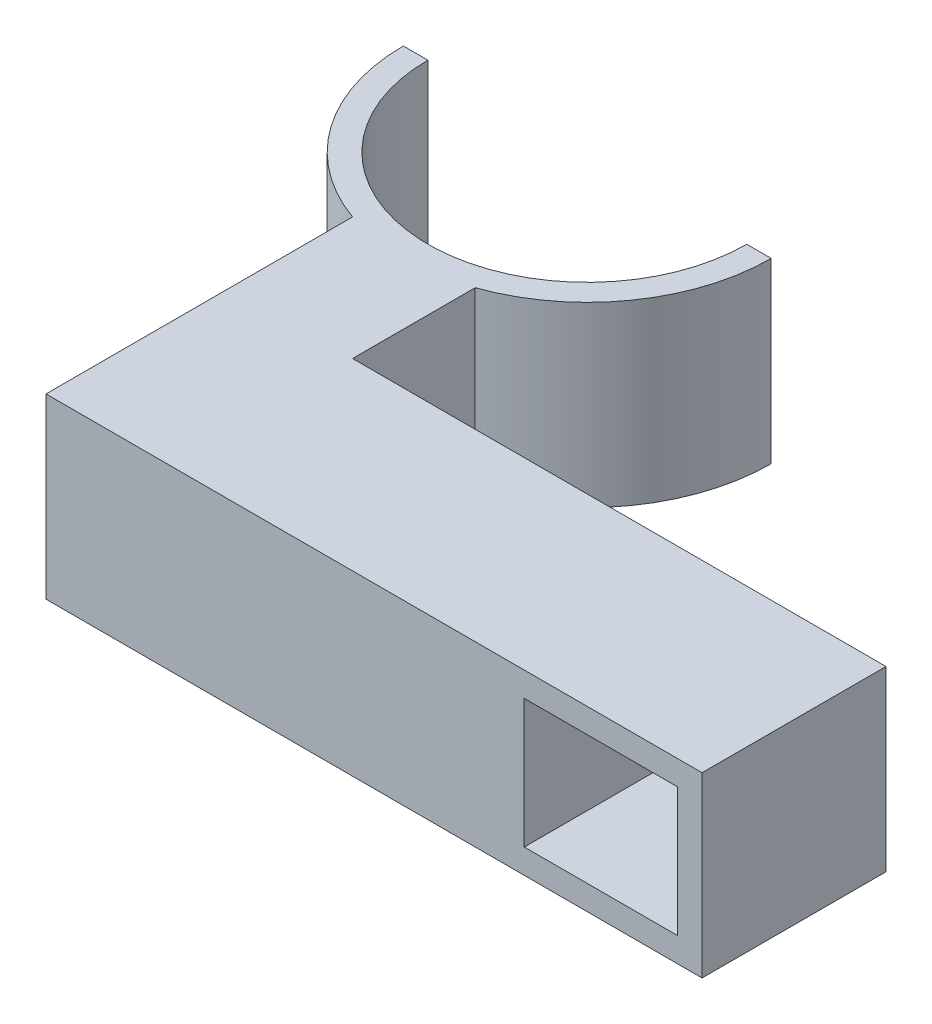
ISO-10303-21;
HEADER;
FILE_DESCRIPTION(('STEP AP214'),'2;1');
FILE_NAME('part.step','',(''),(''),'','','');
FILE_SCHEMA(('AUTOMOTIVE_DESIGN { 1 0 10303 214 1 1 1 1 }'));
ENDSEC;
DATA;
#1=APPLICATION_CONTEXT('core data for automotive mechanical design processes');
#2=APPLICATION_PROTOCOL_DEFINITION('international standard','automotive_design',2000,#1);
#3=PRODUCT_CONTEXT('',#1,'mechanical');
#4=PRODUCT('Part','Part','',(#3));
#5=PRODUCT_RELATED_PRODUCT_CATEGORY('part','',(#4));
#6=PRODUCT_DEFINITION_FORMATION('','',#4);
#7=PRODUCT_DEFINITION_CONTEXT('part definition',#1,'design');
#8=PRODUCT_DEFINITION('design','',#6,#7);
#9=PRODUCT_DEFINITION_SHAPE('','',#8);
#10=(LENGTH_UNIT() NAMED_UNIT(*) SI_UNIT(.MILLI.,.METRE.));
#11=(NAMED_UNIT(*) PLANE_ANGLE_UNIT() SI_UNIT($,.RADIAN.));
#12=(NAMED_UNIT(*) SI_UNIT($,.STERADIAN.) SOLID_ANGLE_UNIT());
#13=UNCERTAINTY_MEASURE_WITH_UNIT(LENGTH_MEASURE(1.E-05),#10,'distance_accuracy_value','');
#14=(GEOMETRIC_REPRESENTATION_CONTEXT(3) GLOBAL_UNCERTAINTY_ASSIGNED_CONTEXT((#13)) GLOBAL_UNIT_ASSIGNED_CONTEXT((#10,
#11,#12)) REPRESENTATION_CONTEXT('',''));
#15=CARTESIAN_POINT('',(0.,0.,0.));
#16=DIRECTION('',(0.,0.,1.));
#17=DIRECTION('',(1.,0.,0.));
#18=AXIS2_PLACEMENT_3D('',#15,#16,#17);
#19=CARTESIAN_POINT('',(0.,0.,15.));
#20=DIRECTION('',(0.,0.,-1.));
#21=DIRECTION('',(-1.,0.,0.));
#22=AXIS2_PLACEMENT_3D('',#19,#20,#21);
#23=PLANE('',#22);
#24=DIRECTION('',(-1.,0.,0.));
#25=VECTOR('',#24,1.);
#26=CARTESIAN_POINT('',(-2.,2.,15.));
#27=LINE('',#26,#25);
#28=CARTESIAN_POINT('',(14.5,2.,15.));
#29=VERTEX_POINT('',#28);
#30=CARTESIAN_POINT('',(-39.,2.,15.));
#31=VERTEX_POINT('',#30);
#32=EDGE_CURVE('E232',#29,#31,#27,.T.);
#33=ORIENTED_EDGE('',*,*,#32,.T.);
#34=DIRECTION('',(0.,1.,0.));
#35=VECTOR('',#34,1.);
#36=CARTESIAN_POINT('',(-39.,2.,15.));
#37=LINE('',#36,#35);
#38=CARTESIAN_POINT('',(-39.,-12.5,15.));
#39=VERTEX_POINT('',#38);
#40=EDGE_CURVE('E197',#39,#31,#37,.T.);
#41=ORIENTED_EDGE('',*,*,#40,.F.);
#42=DIRECTION('',(1.,0.,0.));
#43=VECTOR('',#42,1.);
#44=CARTESIAN_POINT('',(-2.,-12.5,15.));
#45=LINE('',#44,#43);
#46=CARTESIAN_POINT('',(14.5,-12.5,15.));
#47=VERTEX_POINT('',#46);
#48=EDGE_CURVE('E234',#39,#47,#45,.T.);
#49=ORIENTED_EDGE('',*,*,#48,.T.);
#50=DIRECTION('',(0.,1.,0.));
#51=VECTOR('',#50,1.);
#52=CARTESIAN_POINT('',(14.5,2.,15.));
#53=LINE('',#52,#51);
#54=EDGE_CURVE('E237',#47,#29,#53,.T.);
#55=ORIENTED_EDGE('',*,*,#54,.T.);
#56=EDGE_LOOP('',(#33,#41,#49,#55));
#57=FACE_BOUND('',#56,.T.);
#58=DIRECTION('',(0.,-1.,0.));
#59=VECTOR('',#58,1.);
#60=CARTESIAN_POINT('',(0.,0.,15.));
#61=LINE('',#60,#59);
#62=CARTESIAN_POINT('',(0.,0.,15.));
#63=VERTEX_POINT('',#62);
#64=CARTESIAN_POINT('',(0.,-10.5,15.));
#65=VERTEX_POINT('',#64);
#66=EDGE_CURVE('E203',#63,#65,#61,.T.);
#67=ORIENTED_EDGE('',*,*,#66,.F.);
#68=DIRECTION('',(-1.,0.,0.));
#69=VECTOR('',#68,1.);
#70=CARTESIAN_POINT('',(0.,0.,15.));
#71=LINE('',#70,#69);
#72=CARTESIAN_POINT('',(12.5,0.,15.));
#73=VERTEX_POINT('',#72);
#74=EDGE_CURVE('E210',#73,#63,#71,.T.);
#75=ORIENTED_EDGE('',*,*,#74,.F.);
#76=DIRECTION('',(0.,1.,0.));
#77=VECTOR('',#76,1.);
#78=CARTESIAN_POINT('',(12.5,0.,15.));
#79=LINE('',#78,#77);
#80=CARTESIAN_POINT('',(12.5,-10.5,15.));
#81=VERTEX_POINT('',#80);
#82=EDGE_CURVE('E208',#81,#73,#79,.T.);
#83=ORIENTED_EDGE('',*,*,#82,.F.);
#84=DIRECTION('',(1.,0.,0.));
#85=VECTOR('',#84,1.);
#86=CARTESIAN_POINT('',(0.,-10.5,15.));
#87=LINE('',#86,#85);
#88=EDGE_CURVE('E205',#65,#81,#87,.T.);
#89=ORIENTED_EDGE('',*,*,#88,.F.);
#90=EDGE_LOOP('',(#67,#75,#83,#89));
#91=FACE_BOUND('',#90,.T.);
#92=ADVANCED_FACE('F33',(#57,#91),#23,.F.);
#93=CARTESIAN_POINT('',(0.,0.,0.));
#94=DIRECTION('',(0.,0.,-1.));
#95=DIRECTION('',(-1.,0.,0.));
#96=AXIS2_PLACEMENT_3D('',#93,#94,#95);
#97=PLANE('',#96);
#98=DIRECTION('',(0.,-1.,0.));
#99=VECTOR('',#98,1.);
#100=CARTESIAN_POINT('',(-29.,2.,0.));
#101=LINE('',#100,#99);
#102=CARTESIAN_POINT('',(-29.,2.,0.));
#103=VERTEX_POINT('',#102);
#104=CARTESIAN_POINT('',(-29.,-12.5,0.));
#105=VERTEX_POINT('',#104);
#106=EDGE_CURVE('E48',#103,#105,#101,.T.);
#107=ORIENTED_EDGE('',*,*,#106,.F.);
#108=DIRECTION('',(-1.,0.,0.));
#109=VECTOR('',#108,1.);
#110=CARTESIAN_POINT('',(-2.,2.,0.));
#111=LINE('',#110,#109);
#112=CARTESIAN_POINT('',(14.5,2.,0.));
#113=VERTEX_POINT('',#112);
#114=EDGE_CURVE('E231',#113,#103,#111,.T.);
#115=ORIENTED_EDGE('',*,*,#114,.F.);
#116=DIRECTION('',(0.,1.,0.));
#117=VECTOR('',#116,1.);
#118=CARTESIAN_POINT('',(14.5,2.,0.));
#119=LINE('',#118,#117);
#120=CARTESIAN_POINT('',(14.5,-12.5,0.));
#121=VERTEX_POINT('',#120);
#122=EDGE_CURVE('E235',#121,#113,#119,.T.);
#123=ORIENTED_EDGE('',*,*,#122,.F.);
#124=DIRECTION('',(1.,0.,0.));
#125=VECTOR('',#124,1.);
#126=CARTESIAN_POINT('',(-2.,-12.5,0.));
#127=LINE('',#126,#125);
#128=EDGE_CURVE('E240',#105,#121,#127,.T.);
#129=ORIENTED_EDGE('',*,*,#128,.F.);
#130=EDGE_LOOP('',(#107,#115,#123,#129));
#131=FACE_BOUND('',#130,.T.);
#132=DIRECTION('',(-1.,0.,0.));
#133=VECTOR('',#132,1.);
#134=CARTESIAN_POINT('',(0.,0.,0.));
#135=LINE('',#134,#133);
#136=CARTESIAN_POINT('',(12.5,0.,0.));
#137=VERTEX_POINT('',#136);
#138=CARTESIAN_POINT('',(0.,0.,0.));
#139=VERTEX_POINT('',#138);
#140=EDGE_CURVE('E206',#137,#139,#135,.T.);
#141=ORIENTED_EDGE('',*,*,#140,.T.);
#142=DIRECTION('',(0.,-1.,0.));
#143=VECTOR('',#142,1.);
#144=CARTESIAN_POINT('',(0.,0.,0.));
#145=LINE('',#144,#143);
#146=CARTESIAN_POINT('',(0.,-10.5,0.));
#147=VERTEX_POINT('',#146);
#148=EDGE_CURVE('E202',#139,#147,#145,.T.);
#149=ORIENTED_EDGE('',*,*,#148,.T.);
#150=DIRECTION('',(1.,0.,0.));
#151=VECTOR('',#150,1.);
#152=CARTESIAN_POINT('',(0.,-10.5,0.));
#153=LINE('',#152,#151);
#154=CARTESIAN_POINT('',(12.5,-10.5,0.));
#155=VERTEX_POINT('',#154);
#156=EDGE_CURVE('E215',#147,#155,#153,.T.);
#157=ORIENTED_EDGE('',*,*,#156,.T.);
#158=DIRECTION('',(0.,1.,0.));
#159=VECTOR('',#158,1.);
#160=CARTESIAN_POINT('',(12.5,0.,0.));
#161=LINE('',#160,#159);
#162=EDGE_CURVE('E218',#155,#137,#161,.T.);
#163=ORIENTED_EDGE('',*,*,#162,.T.);
#164=EDGE_LOOP('',(#141,#149,#157,#163));
#165=FACE_BOUND('',#164,.T.);
#166=ADVANCED_FACE('F251',(#131,#165),#97,.T.);
#167=CARTESIAN_POINT('',(-2.,2.,15.));
#168=DIRECTION('',(0.,-1.,0.));
#169=DIRECTION('',(0.,0.,-1.));
#170=AXIS2_PLACEMENT_3D('',#167,#168,#169);
#171=PLANE('',#170);
#172=DIRECTION('',(0.,0.,1.));
#173=VECTOR('',#172,1.);
#174=CARTESIAN_POINT('',(-29.,2.,-10.));
#175=LINE('',#174,#173);
#176=CARTESIAN_POINT('',(-29.,2.,-10.));
#177=VERTEX_POINT('',#176);
#178=EDGE_CURVE('E191',#177,#103,#175,.T.);
#179=ORIENTED_EDGE('',*,*,#178,.F.);
#180=CARTESIAN_POINT('',(-34.,2.,-24.142135623731));
#181=DIRECTION('',(0.,1.,0.));
#182=DIRECTION('',(0.,0.,1.));
#183=AXIS2_PLACEMENT_3D('',#180,#181,#182);
#184=CIRCLE('',#183,15.);
#185=CARTESIAN_POINT('',(-19.,2.,-24.142135623731));
#186=VERTEX_POINT('',#185);
#187=EDGE_CURVE('E172',#177,#186,#184,.T.);
#188=ORIENTED_EDGE('',*,*,#187,.T.);
#189=DIRECTION('',(-1.,0.,0.));
#190=VECTOR('',#189,1.);
#191=CARTESIAN_POINT('',(-19.,2.,-24.142135623731));
#192=LINE('',#191,#190);
#193=CARTESIAN_POINT('',(-21.,2.,-24.142135623731));
#194=VERTEX_POINT('',#193);
#195=EDGE_CURVE('E154',#186,#194,#192,.T.);
#196=ORIENTED_EDGE('',*,*,#195,.T.);
#197=CARTESIAN_POINT('',(-34.,2.,-24.142135623731));
#198=DIRECTION('',(0.,-1.,0.));
#199=DIRECTION('',(0.,0.,1.));
#200=AXIS2_PLACEMENT_3D('',#197,#198,#199);
#201=CIRCLE('',#200,13.);
#202=CARTESIAN_POINT('',(-47.,2.,-24.142135623731));
#203=VERTEX_POINT('',#202);
#204=EDGE_CURVE('E174',#194,#203,#201,.T.);
#205=ORIENTED_EDGE('',*,*,#204,.T.);
#206=DIRECTION('',(-1.,0.,0.));
#207=VECTOR('',#206,1.);
#208=CARTESIAN_POINT('',(-47.,2.,-24.142135623731));
#209=LINE('',#208,#207);
#210=CARTESIAN_POINT('',(-49.,2.,-24.142135623731));
#211=VERTEX_POINT('',#210);
#212=EDGE_CURVE('E147',#203,#211,#209,.T.);
#213=ORIENTED_EDGE('',*,*,#212,.T.);
#214=CARTESIAN_POINT('',(-39.,2.,-10.));
#215=VERTEX_POINT('',#214);
#216=EDGE_CURVE('E169',#211,#215,#184,.T.);
#217=ORIENTED_EDGE('',*,*,#216,.T.);
#218=DIRECTION('',(0.,0.,-1.));
#219=VECTOR('',#218,1.);
#220=CARTESIAN_POINT('',(-39.,2.,0.));
#221=LINE('',#220,#219);
#222=EDGE_CURVE('E200',#31,#215,#221,.T.);
#223=ORIENTED_EDGE('',*,*,#222,.F.);
#224=ORIENTED_EDGE('',*,*,#32,.F.);
#225=DIRECTION('',(0.,0.,-1.));
#226=VECTOR('',#225,1.);
#227=CARTESIAN_POINT('',(14.5,2.,15.));
#228=LINE('',#227,#226);
#229=EDGE_CURVE('E41',#29,#113,#228,.T.);
#230=ORIENTED_EDGE('',*,*,#229,.T.);
#231=ORIENTED_EDGE('',*,*,#114,.T.);
#232=EDGE_LOOP('',(#179,#188,#196,#205,#213,#217,#223,#224,#230,#231));
#233=FACE_BOUND('',#232,.T.);
#234=ADVANCED_FACE('F35',(#233),#171,.F.);
#235=CARTESIAN_POINT('',(-2.,-12.5,15.));
#236=DIRECTION('',(0.,1.,0.));
#237=DIRECTION('',(0.,0.,1.));
#238=AXIS2_PLACEMENT_3D('',#235,#236,#237);
#239=PLANE('',#238);
#240=DIRECTION('',(0.,0.,1.));
#241=VECTOR('',#240,1.);
#242=CARTESIAN_POINT('',(-39.,-12.5,0.));
#243=LINE('',#242,#241);
#244=CARTESIAN_POINT('',(-39.,-12.5,-10.));
#245=VERTEX_POINT('',#244);
#246=EDGE_CURVE('E194',#245,#39,#243,.T.);
#247=ORIENTED_EDGE('',*,*,#246,.F.);
#248=CARTESIAN_POINT('',(-34.,-12.5,-24.142135623731));
#249=DIRECTION('',(0.,1.,0.));
#250=DIRECTION('',(0.,0.,1.));
#251=AXIS2_PLACEMENT_3D('',#248,#249,#250);
#252=CIRCLE('',#251,15.);
#253=CARTESIAN_POINT('',(-49.,-12.5,-24.142135623731));
#254=VERTEX_POINT('',#253);
#255=EDGE_CURVE('E146',#254,#245,#252,.T.);
#256=ORIENTED_EDGE('',*,*,#255,.F.);
#257=DIRECTION('',(-1.,0.,0.));
#258=VECTOR('',#257,1.);
#259=CARTESIAN_POINT('',(-47.,-12.5,-24.142135623731));
#260=LINE('',#259,#258);
#261=CARTESIAN_POINT('',(-47.,-12.5,-24.142135623731));
#262=VERTEX_POINT('',#261);
#263=EDGE_CURVE('E156',#262,#254,#260,.T.);
#264=ORIENTED_EDGE('',*,*,#263,.F.);
#265=CARTESIAN_POINT('',(-34.,-12.5,-24.142135623731));
#266=DIRECTION('',(0.,-1.,0.));
#267=DIRECTION('',(0.,0.,1.));
#268=AXIS2_PLACEMENT_3D('',#265,#266,#267);
#269=CIRCLE('',#268,13.);
#270=CARTESIAN_POINT('',(-21.,-12.5,-24.142135623731));
#271=VERTEX_POINT('',#270);
#272=EDGE_CURVE('E162',#271,#262,#269,.T.);
#273=ORIENTED_EDGE('',*,*,#272,.F.);
#274=DIRECTION('',(-1.,0.,0.));
#275=VECTOR('',#274,1.);
#276=CARTESIAN_POINT('',(-19.,-12.5,-24.142135623731));
#277=LINE('',#276,#275);
#278=CARTESIAN_POINT('',(-19.,-12.5,-24.142135623731));
#279=VERTEX_POINT('',#278);
#280=EDGE_CURVE('E152',#279,#271,#277,.T.);
#281=ORIENTED_EDGE('',*,*,#280,.F.);
#282=CARTESIAN_POINT('',(-29.,-12.5,-10.));
#283=VERTEX_POINT('',#282);
#284=EDGE_CURVE('E136',#283,#279,#252,.T.);
#285=ORIENTED_EDGE('',*,*,#284,.F.);
#286=DIRECTION('',(0.,0.,1.));
#287=VECTOR('',#286,1.);
#288=CARTESIAN_POINT('',(-29.,-12.5,-10.));
#289=LINE('',#288,#287);
#290=EDGE_CURVE('E188',#283,#105,#289,.T.);
#291=ORIENTED_EDGE('',*,*,#290,.T.);
#292=ORIENTED_EDGE('',*,*,#128,.T.);
#293=DIRECTION('',(0.,0.,-1.));
#294=VECTOR('',#293,1.);
#295=CARTESIAN_POINT('',(14.5,-12.5,15.));
#296=LINE('',#295,#294);
#297=EDGE_CURVE('E11',#47,#121,#296,.T.);
#298=ORIENTED_EDGE('',*,*,#297,.F.);
#299=ORIENTED_EDGE('',*,*,#48,.F.);
#300=EDGE_LOOP('',(#247,#256,#264,#273,#281,#285,#291,#292,#298,#299));
#301=FACE_BOUND('',#300,.T.);
#302=ADVANCED_FACE('F159',(#301),#239,.F.);
#303=CARTESIAN_POINT('',(14.5,2.,15.));
#304=DIRECTION('',(-1.,0.,0.));
#305=DIRECTION('',(0.,0.,1.));
#306=AXIS2_PLACEMENT_3D('',#303,#304,#305);
#307=PLANE('',#306);
#308=ORIENTED_EDGE('',*,*,#122,.T.);
#309=ORIENTED_EDGE('',*,*,#229,.F.);
#310=ORIENTED_EDGE('',*,*,#54,.F.);
#311=ORIENTED_EDGE('',*,*,#297,.T.);
#312=EDGE_LOOP('',(#308,#309,#310,#311));
#313=FACE_BOUND('',#312,.T.);
#314=ADVANCED_FACE('F253',(#313),#307,.F.);
#315=CARTESIAN_POINT('',(0.,0.,15.));
#316=DIRECTION('',(1.,0.,0.));
#317=DIRECTION('',(0.,1.,0.));
#318=AXIS2_PLACEMENT_3D('',#315,#316,#317);
#319=PLANE('',#318);
#320=ORIENTED_EDGE('',*,*,#148,.F.);
#321=DIRECTION('',(0.,0.,-1.));
#322=VECTOR('',#321,1.);
#323=CARTESIAN_POINT('',(0.,0.,15.));
#324=LINE('',#323,#322);
#325=EDGE_CURVE('E212',#63,#139,#324,.T.);
#326=ORIENTED_EDGE('',*,*,#325,.F.);
#327=ORIENTED_EDGE('',*,*,#66,.T.);
#328=DIRECTION('',(0.,0.,-1.));
#329=VECTOR('',#328,1.);
#330=CARTESIAN_POINT('',(0.,-10.5,15.));
#331=LINE('',#330,#329);
#332=EDGE_CURVE('E228',#65,#147,#331,.T.);
#333=ORIENTED_EDGE('',*,*,#332,.T.);
#334=EDGE_LOOP('',(#320,#326,#327,#333));
#335=FACE_BOUND('',#334,.T.);
#336=ADVANCED_FACE('F281',(#335),#319,.T.);
#337=CARTESIAN_POINT('',(0.,-10.5,15.));
#338=DIRECTION('',(0.,1.,0.));
#339=DIRECTION('',(0.,0.,1.));
#340=AXIS2_PLACEMENT_3D('',#337,#338,#339);
#341=PLANE('',#340);
#342=ORIENTED_EDGE('',*,*,#156,.F.);
#343=ORIENTED_EDGE('',*,*,#332,.F.);
#344=ORIENTED_EDGE('',*,*,#88,.T.);
#345=DIRECTION('',(0.,0.,-1.));
#346=VECTOR('',#345,1.);
#347=CARTESIAN_POINT('',(12.5,-10.5,15.));
#348=LINE('',#347,#346);
#349=EDGE_CURVE('E226',#81,#155,#348,.T.);
#350=ORIENTED_EDGE('',*,*,#349,.T.);
#351=EDGE_LOOP('',(#342,#343,#344,#350));
#352=FACE_BOUND('',#351,.T.);
#353=ADVANCED_FACE('F283',(#352),#341,.T.);
#354=CARTESIAN_POINT('',(12.5,0.,15.));
#355=DIRECTION('',(-1.,0.,0.));
#356=DIRECTION('',(0.,-1.,0.));
#357=AXIS2_PLACEMENT_3D('',#354,#355,#356);
#358=PLANE('',#357);
#359=ORIENTED_EDGE('',*,*,#162,.F.);
#360=ORIENTED_EDGE('',*,*,#349,.F.);
#361=ORIENTED_EDGE('',*,*,#82,.T.);
#362=DIRECTION('',(0.,0.,-1.));
#363=VECTOR('',#362,1.);
#364=CARTESIAN_POINT('',(12.5,0.,15.));
#365=LINE('',#364,#363);
#366=EDGE_CURVE('E56',#73,#137,#365,.T.);
#367=ORIENTED_EDGE('',*,*,#366,.T.);
#368=EDGE_LOOP('',(#359,#360,#361,#367));
#369=FACE_BOUND('',#368,.T.);
#370=ADVANCED_FACE('F288',(#369),#358,.T.);
#371=CARTESIAN_POINT('',(0.,0.,15.));
#372=DIRECTION('',(0.,-1.,0.));
#373=DIRECTION('',(0.,0.,-1.));
#374=AXIS2_PLACEMENT_3D('',#371,#372,#373);
#375=PLANE('',#374);
#376=ORIENTED_EDGE('',*,*,#140,.F.);
#377=ORIENTED_EDGE('',*,*,#366,.F.);
#378=ORIENTED_EDGE('',*,*,#74,.T.);
#379=ORIENTED_EDGE('',*,*,#325,.T.);
#380=EDGE_LOOP('',(#376,#377,#378,#379));
#381=FACE_BOUND('',#380,.T.);
#382=ADVANCED_FACE('F286',(#381),#375,.T.);
#383=CARTESIAN_POINT('',(-39.,0.,0.));
#384=DIRECTION('',(-1.,0.,0.));
#385=DIRECTION('',(0.,0.,1.));
#386=AXIS2_PLACEMENT_3D('',#383,#384,#385);
#387=PLANE('',#386);
#388=ORIENTED_EDGE('',*,*,#222,.T.);
#389=DIRECTION('',(0.,1.,0.));
#390=VECTOR('',#389,1.);
#391=CARTESIAN_POINT('',(-39.,2.,-10.));
#392=LINE('',#391,#390);
#393=EDGE_CURVE('E184',#245,#215,#392,.T.);
#394=ORIENTED_EDGE('',*,*,#393,.F.);
#395=ORIENTED_EDGE('',*,*,#246,.T.);
#396=ORIENTED_EDGE('',*,*,#40,.T.);
#397=EDGE_LOOP('',(#388,#394,#395,#396));
#398=FACE_BOUND('',#397,.T.);
#399=ADVANCED_FACE('F268',(#398),#387,.T.);
#400=CARTESIAN_POINT('',(-29.,2.,-10.));
#401=DIRECTION('',(-1.,0.,0.));
#402=DIRECTION('',(0.,0.,1.));
#403=AXIS2_PLACEMENT_3D('',#400,#401,#402);
#404=PLANE('',#403);
#405=ORIENTED_EDGE('',*,*,#106,.T.);
#406=ORIENTED_EDGE('',*,*,#290,.F.);
#407=DIRECTION('',(0.,-1.,0.));
#408=VECTOR('',#407,1.);
#409=CARTESIAN_POINT('',(-29.,2.,-10.));
#410=LINE('',#409,#408);
#411=EDGE_CURVE('E142',#177,#283,#410,.T.);
#412=ORIENTED_EDGE('',*,*,#411,.F.);
#413=ORIENTED_EDGE('',*,*,#178,.T.);
#414=EDGE_LOOP('',(#405,#406,#412,#413));
#415=FACE_BOUND('',#414,.T.);
#416=ADVANCED_FACE('F256',(#415),#404,.F.);
#417=CARTESIAN_POINT('',(-34.,-12.5,-24.142135623731));
#418=DIRECTION('',(0.,1.,0.));
#419=DIRECTION('',(0.,0.,1.));
#420=AXIS2_PLACEMENT_3D('',#417,#418,#419);
#421=CYLINDRICAL_SURFACE('',#420,15.);
#422=ORIENTED_EDGE('',*,*,#411,.T.);
#423=ORIENTED_EDGE('',*,*,#284,.T.);
#424=DIRECTION('',(0.,1.,0.));
#425=VECTOR('',#424,1.);
#426=CARTESIAN_POINT('',(-19.,-12.5,-24.142135623731));
#427=LINE('',#426,#425);
#428=EDGE_CURVE('E140',#279,#186,#427,.T.);
#429=ORIENTED_EDGE('',*,*,#428,.T.);
#430=ORIENTED_EDGE('',*,*,#187,.F.);
#431=EDGE_LOOP('',(#422,#423,#429,#430));
#432=FACE_BOUND('',#431,.T.);
#433=ADVANCED_FACE('F138',(#432),#421,.T.);
#434=ORIENTED_EDGE('',*,*,#393,.T.);
#435=ORIENTED_EDGE('',*,*,#216,.F.);
#436=DIRECTION('',(0.,1.,0.));
#437=VECTOR('',#436,1.);
#438=CARTESIAN_POINT('',(-49.,-12.5,-24.142135623731));
#439=LINE('',#438,#437);
#440=EDGE_CURVE('E179',#254,#211,#439,.T.);
#441=ORIENTED_EDGE('',*,*,#440,.F.);
#442=ORIENTED_EDGE('',*,*,#255,.T.);
#443=EDGE_LOOP('',(#434,#435,#441,#442));
#444=FACE_BOUND('',#443,.T.);
#445=ADVANCED_FACE('F265',(#444),#421,.T.);
#446=CARTESIAN_POINT('',(-47.,-12.5,-24.142135623731));
#447=DIRECTION('',(0.,0.,-1.));
#448=DIRECTION('',(-1.,0.,0.));
#449=AXIS2_PLACEMENT_3D('',#446,#447,#448);
#450=PLANE('',#449);
#451=ORIENTED_EDGE('',*,*,#212,.F.);
#452=DIRECTION('',(0.,1.,0.));
#453=VECTOR('',#452,1.);
#454=CARTESIAN_POINT('',(-47.,-12.5,-24.142135623731));
#455=LINE('',#454,#453);
#456=EDGE_CURVE('E181',#262,#203,#455,.T.);
#457=ORIENTED_EDGE('',*,*,#456,.F.);
#458=ORIENTED_EDGE('',*,*,#263,.T.);
#459=ORIENTED_EDGE('',*,*,#440,.T.);
#460=EDGE_LOOP('',(#451,#457,#458,#459));
#461=FACE_BOUND('',#460,.T.);
#462=ADVANCED_FACE('F261',(#461),#450,.T.);
#463=CARTESIAN_POINT('',(-34.,-12.5,-24.142135623731));
#464=DIRECTION('',(0.,1.,0.));
#465=DIRECTION('',(0.,0.,1.));
#466=AXIS2_PLACEMENT_3D('',#463,#464,#465);
#467=CYLINDRICAL_SURFACE('',#466,13.);
#468=ORIENTED_EDGE('',*,*,#204,.F.);
#469=DIRECTION('',(0.,1.,0.));
#470=VECTOR('',#469,1.);
#471=CARTESIAN_POINT('',(-21.,-12.5,-24.142135623731));
#472=LINE('',#471,#470);
#473=EDGE_CURVE('E155',#271,#194,#472,.T.);
#474=ORIENTED_EDGE('',*,*,#473,.F.);
#475=ORIENTED_EDGE('',*,*,#272,.T.);
#476=ORIENTED_EDGE('',*,*,#456,.T.);
#477=EDGE_LOOP('',(#468,#474,#475,#476));
#478=FACE_BOUND('',#477,.T.);
#479=ADVANCED_FACE('F418',(#478),#467,.F.);
#480=CARTESIAN_POINT('',(-19.,-12.5,-24.142135623731));
#481=DIRECTION('',(0.,0.,-1.));
#482=DIRECTION('',(-1.,0.,0.));
#483=AXIS2_PLACEMENT_3D('',#480,#481,#482);
#484=PLANE('',#483);
#485=ORIENTED_EDGE('',*,*,#195,.F.);
#486=ORIENTED_EDGE('',*,*,#428,.F.);
#487=ORIENTED_EDGE('',*,*,#280,.T.);
#488=ORIENTED_EDGE('',*,*,#473,.T.);
#489=EDGE_LOOP('',(#485,#486,#487,#488));
#490=FACE_BOUND('',#489,.T.);
#491=ADVANCED_FACE('F151',(#490),#484,.T.);
#492=CLOSED_SHELL('',(#92,#166,#234,#302,#314,#336,#353,#370,#382,#399,#416,#433,#445,#462,#479,#491));
#493=MANIFOLD_SOLID_BREP('B2',#492);
#494=ADVANCED_BREP_SHAPE_REPRESENTATION('',(#18,#493),#14);
#495=SHAPE_DEFINITION_REPRESENTATION(#9,#494);
ENDSEC;
END-ISO-10303-21;
